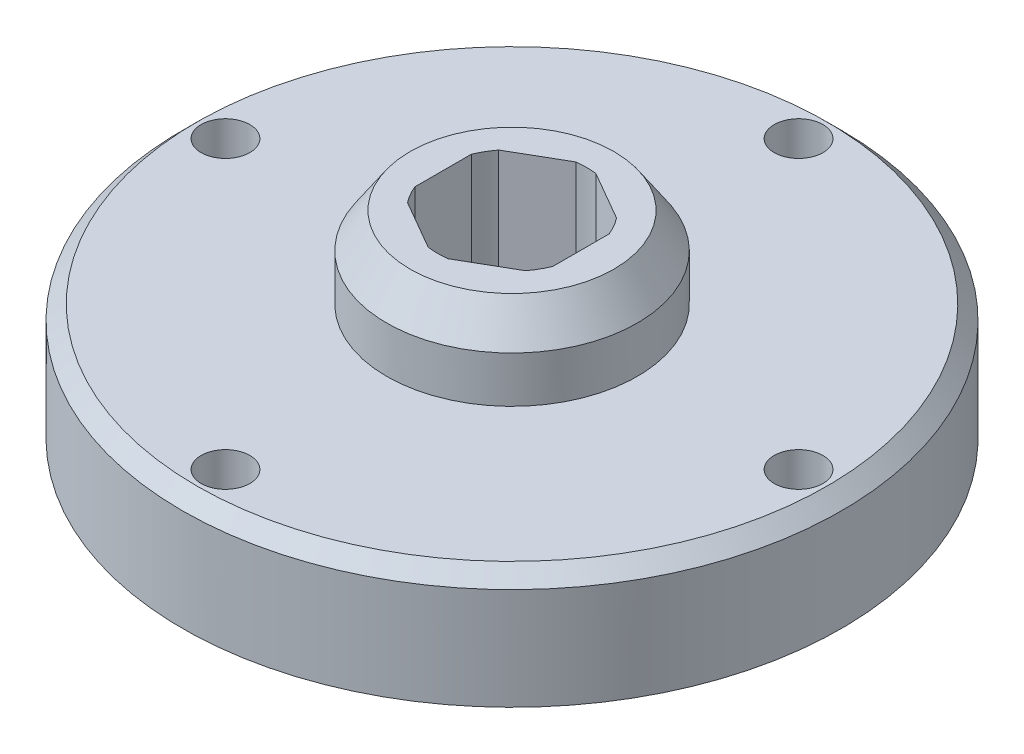
ISO-10303-21;
HEADER;
FILE_DESCRIPTION(('STEP AP214'),'2;1');
FILE_NAME('part.step','',(''),(''),'','','');
FILE_SCHEMA(('AUTOMOTIVE_DESIGN { 1 0 10303 214 1 1 1 1 }'));
ENDSEC;
DATA;
#1=APPLICATION_CONTEXT('core data for automotive mechanical design processes');
#2=APPLICATION_PROTOCOL_DEFINITION('international standard','automotive_design',2000,#1);
#3=PRODUCT_CONTEXT('',#1,'mechanical');
#4=PRODUCT('Part','Part','',(#3));
#5=PRODUCT_RELATED_PRODUCT_CATEGORY('part','',(#4));
#6=PRODUCT_DEFINITION_FORMATION('','',#4);
#7=PRODUCT_DEFINITION_CONTEXT('part definition',#1,'design');
#8=PRODUCT_DEFINITION('design','',#6,#7);
#9=PRODUCT_DEFINITION_SHAPE('','',#8);
#10=(LENGTH_UNIT() NAMED_UNIT(*) SI_UNIT(.MILLI.,.METRE.));
#11=(NAMED_UNIT(*) PLANE_ANGLE_UNIT() SI_UNIT($,.RADIAN.));
#12=(NAMED_UNIT(*) SI_UNIT($,.STERADIAN.) SOLID_ANGLE_UNIT());
#13=UNCERTAINTY_MEASURE_WITH_UNIT(LENGTH_MEASURE(1.E-05),#10,'distance_accuracy_value','');
#14=(GEOMETRIC_REPRESENTATION_CONTEXT(3) GLOBAL_UNCERTAINTY_ASSIGNED_CONTEXT((#13)) GLOBAL_UNIT_ASSIGNED_CONTEXT((#10,
#11,#12)) REPRESENTATION_CONTEXT('',''));
#15=CARTESIAN_POINT('',(0.,0.,0.));
#16=DIRECTION('',(0.,0.,1.));
#17=DIRECTION('',(1.,0.,0.));
#18=AXIS2_PLACEMENT_3D('',#15,#16,#17);
#19=CARTESIAN_POINT('',(0.,0.,0.));
#20=DIRECTION('',(0.,-1.,0.));
#21=DIRECTION('',(0.,0.,-1.));
#22=AXIS2_PLACEMENT_3D('',#19,#20,#21);
#23=CYLINDRICAL_SURFACE('',#22,5.2);
#24=CARTESIAN_POINT('',(0.,13.77578,0.));
#25=DIRECTION('',(0.,-1.,0.));
#26=DIRECTION('',(0.,0.,-1.));
#27=AXIS2_PLACEMENT_3D('',#24,#25,#26);
#28=CIRCLE('',#27,5.2);
#29=CARTESIAN_POINT('',(0.700412137687176,13.77578,5.15261320471278));
#30=VERTEX_POINT('',#29);
#31=CARTESIAN_POINT('',(-0.700412137687167,13.77578,5.15261320471278));
#32=VERTEX_POINT('',#31);
#33=EDGE_CURVE('E161',#30,#32,#28,.T.);
#34=ORIENTED_EDGE('',*,*,#33,.F.);
#35=DIRECTION('',(0.,-1.,0.));
#36=VECTOR('',#35,1.);
#37=CARTESIAN_POINT('',(0.700412137687176,17.7342558746265,5.15261320471278));
#38=LINE('',#37,#36);
#39=CARTESIAN_POINT('',(0.700412137687176,4.953,5.15261320471278));
#40=VERTEX_POINT('',#39);
#41=EDGE_CURVE('E147',#30,#40,#38,.T.);
#42=ORIENTED_EDGE('',*,*,#41,.T.);
#43=CARTESIAN_POINT('',(0.,4.953,0.));
#44=DIRECTION('',(0.,-1.,0.));
#45=DIRECTION('',(0.,0.,-1.));
#46=AXIS2_PLACEMENT_3D('',#43,#44,#45);
#47=CIRCLE('',#46,5.2);
#48=CARTESIAN_POINT('',(-0.700412137687167,4.953,5.15261320471278));
#49=VERTEX_POINT('',#48);
#50=EDGE_CURVE('E159',#40,#49,#47,.T.);
#51=ORIENTED_EDGE('',*,*,#50,.T.);
#52=DIRECTION('',(0.,-1.,0.));
#53=VECTOR('',#52,1.);
#54=CARTESIAN_POINT('',(-0.700412137687167,17.7342558746265,5.15261320471278));
#55=LINE('',#54,#53);
#56=EDGE_CURVE('E261',#32,#49,#55,.T.);
#57=ORIENTED_EDGE('',*,*,#56,.F.);
#58=EDGE_LOOP('',(#34,#42,#51,#57));
#59=FACE_BOUND('',#58,.T.);
#60=ADVANCED_FACE('F54',(#59),#23,.F.);
#61=CARTESIAN_POINT('',(4.8125,4.953,1.96973189800033));
#62=VERTEX_POINT('',#61);
#63=CARTESIAN_POINT('',(4.11208786231283,4.953,3.18288130671244));
#64=VERTEX_POINT('',#63);
#65=EDGE_CURVE('E169',#62,#64,#47,.T.);
#66=ORIENTED_EDGE('',*,*,#65,.T.);
#67=DIRECTION('',(0.,-1.,0.));
#68=VECTOR('',#67,1.);
#69=CARTESIAN_POINT('',(4.11208786231283,17.7342558746265,3.18288130671244));
#70=LINE('',#69,#68);
#71=CARTESIAN_POINT('',(4.11208786231283,13.77578,3.18288130671244));
#72=VERTEX_POINT('',#71);
#73=EDGE_CURVE('E150',#72,#64,#70,.T.);
#74=ORIENTED_EDGE('',*,*,#73,.F.);
#75=CARTESIAN_POINT('',(4.8125,13.77578,1.96973189800033));
#76=VERTEX_POINT('',#75);
#77=EDGE_CURVE('E317',#76,#72,#28,.T.);
#78=ORIENTED_EDGE('',*,*,#77,.F.);
#79=DIRECTION('',(0.,-1.,0.));
#80=VECTOR('',#79,1.);
#81=CARTESIAN_POINT('',(4.8125,17.7342558746265,1.96973189800033));
#82=LINE('',#81,#80);
#83=EDGE_CURVE('E221',#76,#62,#82,.T.);
#84=ORIENTED_EDGE('',*,*,#83,.T.);
#85=EDGE_LOOP('',(#66,#74,#78,#84));
#86=FACE_BOUND('',#85,.T.);
#87=ADVANCED_FACE('F360',(#86),#23,.F.);
#88=CARTESIAN_POINT('',(4.11208786231283,4.953,-3.18288130671244));
#89=VERTEX_POINT('',#88);
#90=CARTESIAN_POINT('',(4.8125,4.953,-1.96973189800033));
#91=VERTEX_POINT('',#90);
#92=EDGE_CURVE('E175',#89,#91,#47,.T.);
#93=ORIENTED_EDGE('',*,*,#92,.T.);
#94=DIRECTION('',(0.,-1.,0.));
#95=VECTOR('',#94,1.);
#96=CARTESIAN_POINT('',(4.8125,17.7342558746265,-1.96973189800033));
#97=LINE('',#96,#95);
#98=CARTESIAN_POINT('',(4.8125,13.77578,-1.96973189800033));
#99=VERTEX_POINT('',#98);
#100=EDGE_CURVE('E211',#99,#91,#97,.T.);
#101=ORIENTED_EDGE('',*,*,#100,.F.);
#102=CARTESIAN_POINT('',(4.11208786231283,13.77578,-3.18288130671244));
#103=VERTEX_POINT('',#102);
#104=EDGE_CURVE('E672',#103,#99,#28,.T.);
#105=ORIENTED_EDGE('',*,*,#104,.F.);
#106=DIRECTION('',(0.,-1.,0.));
#107=VECTOR('',#106,1.);
#108=CARTESIAN_POINT('',(4.11208786231283,17.7342558746265,-3.18288130671244));
#109=LINE('',#108,#107);
#110=EDGE_CURVE('E213',#103,#89,#109,.T.);
#111=ORIENTED_EDGE('',*,*,#110,.T.);
#112=EDGE_LOOP('',(#93,#101,#105,#111));
#113=FACE_BOUND('',#112,.T.);
#114=ADVANCED_FACE('F209',(#113),#23,.F.);
#115=CARTESIAN_POINT('',(-0.700412137687172,4.953,-5.15261320471278));
#116=VERTEX_POINT('',#115);
#117=CARTESIAN_POINT('',(0.700412137687175,4.953,-5.15261320471278));
#118=VERTEX_POINT('',#117);
#119=EDGE_CURVE('E192',#116,#118,#47,.T.);
#120=ORIENTED_EDGE('',*,*,#119,.T.);
#121=DIRECTION('',(0.,-1.,0.));
#122=VECTOR('',#121,1.);
#123=CARTESIAN_POINT('',(0.700412137687175,17.7342558746265,-5.15261320471278));
#124=LINE('',#123,#122);
#125=CARTESIAN_POINT('',(0.700412137687175,13.77578,-5.15261320471278));
#126=VERTEX_POINT('',#125);
#127=EDGE_CURVE('E230',#126,#118,#124,.T.);
#128=ORIENTED_EDGE('',*,*,#127,.F.);
#129=CARTESIAN_POINT('',(-0.700412137687172,13.77578,-5.15261320471278));
#130=VERTEX_POINT('',#129);
#131=EDGE_CURVE('E674',#130,#126,#28,.T.);
#132=ORIENTED_EDGE('',*,*,#131,.F.);
#133=DIRECTION('',(0.,-1.,0.));
#134=VECTOR('',#133,1.);
#135=CARTESIAN_POINT('',(-0.700412137687172,17.7342558746265,-5.15261320471278));
#136=LINE('',#135,#134);
#137=EDGE_CURVE('E245',#130,#116,#136,.T.);
#138=ORIENTED_EDGE('',*,*,#137,.T.);
#139=EDGE_LOOP('',(#120,#128,#132,#138));
#140=FACE_BOUND('',#139,.T.);
#141=ADVANCED_FACE('F381',(#140),#23,.F.);
#142=CARTESIAN_POINT('',(-4.8125,4.953,-1.96973189800034));
#143=VERTEX_POINT('',#142);
#144=CARTESIAN_POINT('',(-4.11208786231283,4.953,-3.18288130671244));
#145=VERTEX_POINT('',#144);
#146=EDGE_CURVE('E183',#143,#145,#47,.T.);
#147=ORIENTED_EDGE('',*,*,#146,.T.);
#148=DIRECTION('',(0.,-1.,0.));
#149=VECTOR('',#148,1.);
#150=CARTESIAN_POINT('',(-4.11208786231283,17.7342558746265,-3.18288130671244));
#151=LINE('',#150,#149);
#152=CARTESIAN_POINT('',(-4.11208786231283,13.77578,-3.18288130671244));
#153=VERTEX_POINT('',#152);
#154=EDGE_CURVE('E237',#153,#145,#151,.T.);
#155=ORIENTED_EDGE('',*,*,#154,.F.);
#156=CARTESIAN_POINT('',(-4.8125,13.77578,-1.96973189800034));
#157=VERTEX_POINT('',#156);
#158=EDGE_CURVE('E177',#157,#153,#28,.T.);
#159=ORIENTED_EDGE('',*,*,#158,.F.);
#160=DIRECTION('',(0.,-1.,0.));
#161=VECTOR('',#160,1.);
#162=CARTESIAN_POINT('',(-4.8125,17.7342558746265,-1.96973189800034));
#163=LINE('',#162,#161);
#164=EDGE_CURVE('E257',#157,#143,#163,.T.);
#165=ORIENTED_EDGE('',*,*,#164,.T.);
#166=EDGE_LOOP('',(#147,#155,#159,#165));
#167=FACE_BOUND('',#166,.T.);
#168=ADVANCED_FACE('F372',(#167),#23,.F.);
#169=CARTESIAN_POINT('',(-4.11208786231283,4.953,3.18288130671244));
#170=VERTEX_POINT('',#169);
#171=CARTESIAN_POINT('',(-4.8125,4.953,1.96973189800034));
#172=VERTEX_POINT('',#171);
#173=EDGE_CURVE('E172',#170,#172,#47,.T.);
#174=ORIENTED_EDGE('',*,*,#173,.T.);
#175=DIRECTION('',(0.,-1.,0.));
#176=VECTOR('',#175,1.);
#177=CARTESIAN_POINT('',(-4.8125,17.7342558746265,1.96973189800034));
#178=LINE('',#177,#176);
#179=CARTESIAN_POINT('',(-4.8125,13.77578,1.96973189800034));
#180=VERTEX_POINT('',#179);
#181=EDGE_CURVE('E249',#180,#172,#178,.T.);
#182=ORIENTED_EDGE('',*,*,#181,.F.);
#183=CARTESIAN_POINT('',(-4.11208786231283,13.77578,3.18288130671244));
#184=VERTEX_POINT('',#183);
#185=EDGE_CURVE('E170',#184,#180,#28,.T.);
#186=ORIENTED_EDGE('',*,*,#185,.F.);
#187=DIRECTION('',(0.,-1.,0.));
#188=VECTOR('',#187,1.);
#189=CARTESIAN_POINT('',(-4.11208786231283,17.7342558746265,3.18288130671244));
#190=LINE('',#189,#188);
#191=EDGE_CURVE('E268',#184,#170,#190,.T.);
#192=ORIENTED_EDGE('',*,*,#191,.T.);
#193=EDGE_LOOP('',(#174,#182,#186,#192));
#194=FACE_BOUND('',#193,.T.);
#195=ADVANCED_FACE('F362',(#194),#23,.F.);
#196=CARTESIAN_POINT('',(23.,0.,0.));
#197=DIRECTION('',(0.,-1.,0.));
#198=DIRECTION('',(0.,0.,-1.));
#199=AXIS2_PLACEMENT_3D('',#196,#197,#198);
#200=PLANE('',#199);
#201=CARTESIAN_POINT('',(0.,0.,0.));
#202=DIRECTION('',(0.,-1.,0.));
#203=DIRECTION('',(0.,0.,-1.));
#204=AXIS2_PLACEMENT_3D('',#201,#202,#203);
#205=CIRCLE('',#204,7.55);
#206=CARTESIAN_POINT('',(0.,0.,-7.55));
#207=VERTEX_POINT('',#206);
#208=EDGE_CURVE('E327',#207,#207,#205,.F.);
#209=ORIENTED_EDGE('',*,*,#208,.T.);
#210=EDGE_LOOP('',(#209));
#211=FACE_BOUND('',#210,.T.);
#212=CARTESIAN_POINT('',(-2.09488880330588E-13,0.,20.));
#213=DIRECTION('',(0.,-1.,0.));
#214=DIRECTION('',(0.,0.,-1.));
#215=AXIS2_PLACEMENT_3D('',#212,#213,#214);
#216=CIRCLE('',#215,1.69999999999999);
#217=CARTESIAN_POINT('',(-2.09488880330588E-13,0.,18.3));
#218=VERTEX_POINT('',#217);
#219=EDGE_CURVE('E272',#218,#218,#216,.T.);
#220=ORIENTED_EDGE('',*,*,#219,.F.);
#221=EDGE_LOOP('',(#220));
#222=FACE_BOUND('',#221,.T.);
#223=CARTESIAN_POINT('',(20.,0.,0.));
#224=DIRECTION('',(0.,-1.,0.));
#225=DIRECTION('',(0.,0.,-1.));
#226=AXIS2_PLACEMENT_3D('',#223,#224,#225);
#227=CIRCLE('',#226,1.69999999999999);
#228=CARTESIAN_POINT('',(20.,0.,-1.69999999999999));
#229=VERTEX_POINT('',#228);
#230=EDGE_CURVE('E284',#229,#229,#227,.T.);
#231=ORIENTED_EDGE('',*,*,#230,.F.);
#232=EDGE_LOOP('',(#231));
#233=FACE_BOUND('',#232,.T.);
#234=CARTESIAN_POINT('',(0.,0.,-20.));
#235=DIRECTION('',(0.,-1.,0.));
#236=DIRECTION('',(0.,0.,-1.));
#237=AXIS2_PLACEMENT_3D('',#234,#235,#236);
#238=CIRCLE('',#237,1.69999999999999);
#239=CARTESIAN_POINT('',(0.,0.,-21.7));
#240=VERTEX_POINT('',#239);
#241=EDGE_CURVE('E292',#240,#240,#238,.T.);
#242=ORIENTED_EDGE('',*,*,#241,.F.);
#243=EDGE_LOOP('',(#242));
#244=FACE_BOUND('',#243,.T.);
#245=CARTESIAN_POINT('',(-20.,0.,0.));
#246=DIRECTION('',(0.,-1.,0.));
#247=DIRECTION('',(0.,0.,-1.));
#248=AXIS2_PLACEMENT_3D('',#245,#246,#247);
#249=CIRCLE('',#248,1.69999999999999);
#250=CARTESIAN_POINT('',(-20.,0.,-1.69999999999999));
#251=VERTEX_POINT('',#250);
#252=EDGE_CURVE('E297',#251,#251,#249,.T.);
#253=ORIENTED_EDGE('',*,*,#252,.F.);
#254=EDGE_LOOP('',(#253));
#255=FACE_BOUND('',#254,.T.);
#256=CARTESIAN_POINT('',(0.,0.,0.));
#257=DIRECTION('',(0.,-1.,0.));
#258=DIRECTION('',(0.,0.,-1.));
#259=AXIS2_PLACEMENT_3D('',#256,#257,#258);
#260=CIRCLE('',#259,23.);
#261=CARTESIAN_POINT('',(0.,0.,-23.));
#262=VERTEX_POINT('',#261);
#263=EDGE_CURVE('E305',#262,#262,#260,.T.);
#264=ORIENTED_EDGE('',*,*,#263,.T.);
#265=EDGE_LOOP('',(#264));
#266=FACE_BOUND('',#265,.T.);
#267=ADVANCED_FACE('F371',(#211,#222,#233,#244,#255,#266),#200,.T.);
#268=CARTESIAN_POINT('',(0.,0.,0.));
#269=DIRECTION('',(0.,-1.,0.));
#270=DIRECTION('',(0.,0.,-1.));
#271=AXIS2_PLACEMENT_3D('',#268,#269,#270);
#272=CYLINDRICAL_SURFACE('',#271,6.8);
#273=CARTESIAN_POINT('',(0.,0.749999999999996,0.));
#274=DIRECTION('',(0.,-1.,0.));
#275=DIRECTION('',(0.,0.,-1.));
#276=AXIS2_PLACEMENT_3D('',#273,#274,#275);
#277=CIRCLE('',#276,6.8);
#278=CARTESIAN_POINT('',(0.,0.749999999999996,-6.8));
#279=VERTEX_POINT('',#278);
#280=EDGE_CURVE('E190',#279,#279,#277,.T.);
#281=ORIENTED_EDGE('',*,*,#280,.T.);
#282=EDGE_LOOP('',(#281));
#283=FACE_BOUND('',#282,.T.);
#284=CARTESIAN_POINT('',(0.,4.953,0.));
#285=DIRECTION('',(0.,-1.,0.));
#286=DIRECTION('',(0.,0.,-1.));
#287=AXIS2_PLACEMENT_3D('',#284,#285,#286);
#288=CIRCLE('',#287,6.8);
#289=CARTESIAN_POINT('',(0.,4.953,-6.8));
#290=VERTEX_POINT('',#289);
#291=EDGE_CURVE('E182',#290,#290,#288,.T.);
#292=ORIENTED_EDGE('',*,*,#291,.F.);
#293=EDGE_LOOP('',(#292));
#294=FACE_BOUND('',#293,.T.);
#295=ADVANCED_FACE('F378',(#283,#294),#272,.F.);
#296=CARTESIAN_POINT('',(6.8,4.953,0.));
#297=DIRECTION('',(0.,-1.,0.));
#298=DIRECTION('',(0.,0.,-1.));
#299=AXIS2_PLACEMENT_3D('',#296,#297,#298);
#300=PLANE('',#299);
#301=ORIENTED_EDGE('',*,*,#291,.T.);
#302=EDGE_LOOP('',(#301));
#303=FACE_BOUND('',#302,.T.);
#304=ORIENTED_EDGE('',*,*,#173,.F.);
#305=DIRECTION('',(-0.866025403784438,0.,-0.5));
#306=VECTOR('',#305,1.);
#307=CARTESIAN_POINT('',(-2.40625,4.953,4.16774725571261));
#308=LINE('',#307,#306);
#309=EDGE_CURVE('E167',#49,#170,#308,.T.);
#310=ORIENTED_EDGE('',*,*,#309,.F.);
#311=ORIENTED_EDGE('',*,*,#50,.F.);
#312=DIRECTION('',(-0.866025403784438,0.,0.5));
#313=VECTOR('',#312,1.);
#314=CARTESIAN_POINT('',(2.40625,4.953,4.16774725571261));
#315=LINE('',#314,#313);
#316=EDGE_CURVE('E144',#64,#40,#315,.T.);
#317=ORIENTED_EDGE('',*,*,#316,.F.);
#318=ORIENTED_EDGE('',*,*,#65,.F.);
#319=DIRECTION('',(0.,0.,1.));
#320=VECTOR('',#319,1.);
#321=CARTESIAN_POINT('',(4.8125,4.953,0.));
#322=LINE('',#321,#320);
#323=EDGE_CURVE('E217',#91,#62,#322,.T.);
#324=ORIENTED_EDGE('',*,*,#323,.F.);
#325=ORIENTED_EDGE('',*,*,#92,.F.);
#326=DIRECTION('',(0.866025403784439,0.,0.5));
#327=VECTOR('',#326,1.);
#328=CARTESIAN_POINT('',(2.40625,4.953,-4.16774725571261));
#329=LINE('',#328,#327);
#330=EDGE_CURVE('E216',#118,#89,#329,.T.);
#331=ORIENTED_EDGE('',*,*,#330,.F.);
#332=ORIENTED_EDGE('',*,*,#119,.F.);
#333=DIRECTION('',(0.866025403784439,0.,-0.5));
#334=VECTOR('',#333,1.);
#335=CARTESIAN_POINT('',(-2.40625,4.953,-4.16774725571261));
#336=LINE('',#335,#334);
#337=EDGE_CURVE('E242',#145,#116,#336,.T.);
#338=ORIENTED_EDGE('',*,*,#337,.F.);
#339=ORIENTED_EDGE('',*,*,#146,.F.);
#340=DIRECTION('',(0.,0.,-1.));
#341=VECTOR('',#340,1.);
#342=CARTESIAN_POINT('',(-4.8125,4.953,0.));
#343=LINE('',#342,#341);
#344=EDGE_CURVE('E254',#172,#143,#343,.T.);
#345=ORIENTED_EDGE('',*,*,#344,.F.);
#346=EDGE_LOOP('',(#304,#310,#311,#317,#318,#324,#325,#331,#332,#338,#339,#345));
#347=FACE_BOUND('',#346,.T.);
#348=ADVANCED_FACE('F166',(#303,#347),#300,.T.);
#349=CARTESIAN_POINT('',(5.2,13.77578,0.));
#350=DIRECTION('',(0.,1.,0.));
#351=DIRECTION('',(0.,0.,1.));
#352=AXIS2_PLACEMENT_3D('',#349,#350,#351);
#353=PLANE('',#352);
#354=ORIENTED_EDGE('',*,*,#185,.T.);
#355=DIRECTION('',(0.,0.,-1.));
#356=VECTOR('',#355,1.);
#357=CARTESIAN_POINT('',(-4.8125,13.77578,0.));
#358=LINE('',#357,#356);
#359=EDGE_CURVE('E258',#180,#157,#358,.T.);
#360=ORIENTED_EDGE('',*,*,#359,.T.);
#361=ORIENTED_EDGE('',*,*,#158,.T.);
#362=DIRECTION('',(0.866025403784439,0.,-0.5));
#363=VECTOR('',#362,1.);
#364=CARTESIAN_POINT('',(-2.40625,13.77578,-4.16774725571261));
#365=LINE('',#364,#363);
#366=EDGE_CURVE('E246',#153,#130,#365,.T.);
#367=ORIENTED_EDGE('',*,*,#366,.T.);
#368=ORIENTED_EDGE('',*,*,#131,.T.);
#369=DIRECTION('',(0.866025403784439,0.,0.5));
#370=VECTOR('',#369,1.);
#371=CARTESIAN_POINT('',(2.40625,13.77578,-4.16774725571261));
#372=LINE('',#371,#370);
#373=EDGE_CURVE('E234',#126,#103,#372,.T.);
#374=ORIENTED_EDGE('',*,*,#373,.T.);
#375=ORIENTED_EDGE('',*,*,#104,.T.);
#376=DIRECTION('',(0.,0.,1.));
#377=VECTOR('',#376,1.);
#378=CARTESIAN_POINT('',(4.8125,13.77578,0.));
#379=LINE('',#378,#377);
#380=EDGE_CURVE('E78',#99,#76,#379,.T.);
#381=ORIENTED_EDGE('',*,*,#380,.T.);
#382=ORIENTED_EDGE('',*,*,#77,.T.);
#383=DIRECTION('',(-0.866025403784438,0.,0.5));
#384=VECTOR('',#383,1.);
#385=CARTESIAN_POINT('',(2.40625,13.77578,4.16774725571261));
#386=LINE('',#385,#384);
#387=EDGE_CURVE('E72',#72,#30,#386,.T.);
#388=ORIENTED_EDGE('',*,*,#387,.T.);
#389=ORIENTED_EDGE('',*,*,#33,.T.);
#390=DIRECTION('',(-0.866025403784438,0.,-0.5));
#391=VECTOR('',#390,1.);
#392=CARTESIAN_POINT('',(-2.40625,13.77578,4.16774725571261));
#393=LINE('',#392,#391);
#394=EDGE_CURVE('E269',#32,#184,#393,.T.);
#395=ORIENTED_EDGE('',*,*,#394,.T.);
#396=EDGE_LOOP('',(#354,#360,#361,#367,#368,#374,#375,#381,#382,#388,#389,#395));
#397=FACE_BOUND('',#396,.T.);
#398=CARTESIAN_POINT('',(0.,13.77578,0.));
#399=DIRECTION('',(0.,-1.,0.));
#400=DIRECTION('',(0.,0.,-1.));
#401=AXIS2_PLACEMENT_3D('',#398,#399,#400);
#402=CIRCLE('',#401,7.112);
#403=CARTESIAN_POINT('',(0.,13.77578,-7.112));
#404=VERTEX_POINT('',#403);
#405=EDGE_CURVE('E309',#404,#404,#402,.T.);
#406=ORIENTED_EDGE('',*,*,#405,.F.);
#407=EDGE_LOOP('',(#406));
#408=FACE_BOUND('',#407,.T.);
#409=ADVANCED_FACE('F357',(#397,#408),#353,.T.);
#410=CARTESIAN_POINT('',(0.,11.11328,0.));
#411=DIRECTION('',(0.,-1.,0.));
#412=DIRECTION('',(0.,0.,-1.));
#413=AXIS2_PLACEMENT_3D('',#410,#411,#412);
#414=CONICAL_SURFACE('',#413,8.9,0.591375272041213);
#415=ORIENTED_EDGE('',*,*,#405,.T.);
#416=EDGE_LOOP('',(#415));
#417=FACE_BOUND('',#416,.T.);
#418=CARTESIAN_POINT('',(0.,11.3366440939597,0.));
#419=DIRECTION('',(0.,-1.,0.));
#420=DIRECTION('',(0.,0.,-1.));
#421=AXIS2_PLACEMENT_3D('',#418,#419,#420);
#422=CIRCLE('',#421,8.75);
#423=CARTESIAN_POINT('',(0.,11.3366440939597,-8.75));
#424=VERTEX_POINT('',#423);
#425=EDGE_CURVE('E312',#424,#424,#422,.T.);
#426=ORIENTED_EDGE('',*,*,#425,.F.);
#427=EDGE_LOOP('',(#426));
#428=FACE_BOUND('',#427,.T.);
#429=ADVANCED_FACE('F352',(#417,#428),#414,.T.);
#430=CARTESIAN_POINT('',(0.,0.,0.));
#431=DIRECTION('',(0.,-1.,0.));
#432=DIRECTION('',(0.,0.,-1.));
#433=AXIS2_PLACEMENT_3D('',#430,#431,#432);
#434=CYLINDRICAL_SURFACE('',#433,8.75);
#435=ORIENTED_EDGE('',*,*,#425,.T.);
#436=EDGE_LOOP('',(#435));
#437=FACE_BOUND('',#436,.T.);
#438=CARTESIAN_POINT('',(0.,8.11328,0.));
#439=DIRECTION('',(0.,1.,0.));
#440=DIRECTION('',(0.,0.,1.));
#441=AXIS2_PLACEMENT_3D('',#438,#439,#440);
#442=CIRCLE('',#441,8.75);
#443=CARTESIAN_POINT('',(0.,8.11328,8.75));
#444=VERTEX_POINT('',#443);
#445=EDGE_CURVE('E58',#444,#444,#442,.F.);
#446=ORIENTED_EDGE('',*,*,#445,.F.);
#447=EDGE_LOOP('',(#446));
#448=FACE_BOUND('',#447,.T.);
#449=ADVANCED_FACE('F56',(#437,#448),#434,.T.);
#450=CARTESIAN_POINT('',(8.9,8.11328,0.));
#451=DIRECTION('',(0.,1.,0.));
#452=DIRECTION('',(0.,0.,1.));
#453=AXIS2_PLACEMENT_3D('',#450,#451,#452);
#454=PLANE('',#453);
#455=CARTESIAN_POINT('',(0.,8.11328,0.));
#456=DIRECTION('',(0.,1.,0.));
#457=DIRECTION('',(0.,0.,1.));
#458=AXIS2_PLACEMENT_3D('',#455,#456,#457);
#459=CIRCLE('',#458,22.);
#460=CARTESIAN_POINT('',(0.,8.11328,22.));
#461=VERTEX_POINT('',#460);
#462=EDGE_CURVE('E12',#461,#461,#459,.T.);
#463=ORIENTED_EDGE('',*,*,#462,.T.);
#464=EDGE_LOOP('',(#463));
#465=FACE_BOUND('',#464,.T.);
#466=CARTESIAN_POINT('',(-2.09488880330588E-13,8.11328,20.));
#467=DIRECTION('',(0.,1.,0.));
#468=DIRECTION('',(0.,0.,1.));
#469=AXIS2_PLACEMENT_3D('',#466,#467,#468);
#470=CIRCLE('',#469,1.69999999999999);
#471=CARTESIAN_POINT('',(-2.09488880330588E-13,8.11328,21.7));
#472=VERTEX_POINT('',#471);
#473=EDGE_CURVE('E280',#472,#472,#470,.T.);
#474=ORIENTED_EDGE('',*,*,#473,.F.);
#475=EDGE_LOOP('',(#474));
#476=FACE_BOUND('',#475,.T.);
#477=CARTESIAN_POINT('',(20.,8.11328,0.));
#478=DIRECTION('',(0.,1.,0.));
#479=DIRECTION('',(0.,0.,1.));
#480=AXIS2_PLACEMENT_3D('',#477,#478,#479);
#481=CIRCLE('',#480,1.69999999999999);
#482=CARTESIAN_POINT('',(20.,8.11328,1.69999999999999));
#483=VERTEX_POINT('',#482);
#484=EDGE_CURVE('E288',#483,#483,#481,.T.);
#485=ORIENTED_EDGE('',*,*,#484,.F.);
#486=EDGE_LOOP('',(#485));
#487=FACE_BOUND('',#486,.T.);
#488=CARTESIAN_POINT('',(0.,8.11328,-20.));
#489=DIRECTION('',(0.,1.,0.));
#490=DIRECTION('',(0.,0.,1.));
#491=AXIS2_PLACEMENT_3D('',#488,#489,#490);
#492=CIRCLE('',#491,1.69999999999999);
#493=CARTESIAN_POINT('',(0.,8.11328,-18.3));
#494=VERTEX_POINT('',#493);
#495=EDGE_CURVE('E296',#494,#494,#492,.T.);
#496=ORIENTED_EDGE('',*,*,#495,.F.);
#497=EDGE_LOOP('',(#496));
#498=FACE_BOUND('',#497,.T.);
#499=CARTESIAN_POINT('',(-20.,8.11328,0.));
#500=DIRECTION('',(0.,1.,0.));
#501=DIRECTION('',(0.,0.,1.));
#502=AXIS2_PLACEMENT_3D('',#499,#500,#501);
#503=CIRCLE('',#502,1.69999999999999);
#504=CARTESIAN_POINT('',(-20.,8.11328,1.69999999999999));
#505=VERTEX_POINT('',#504);
#506=EDGE_CURVE('E301',#505,#505,#503,.T.);
#507=ORIENTED_EDGE('',*,*,#506,.F.);
#508=EDGE_LOOP('',(#507));
#509=FACE_BOUND('',#508,.T.);
#510=ORIENTED_EDGE('',*,*,#445,.T.);
#511=EDGE_LOOP('',(#510));
#512=FACE_BOUND('',#511,.T.);
#513=ADVANCED_FACE('F341',(#465,#476,#487,#498,#509,#512),#454,.T.);
#514=CARTESIAN_POINT('',(0.,0.,0.));
#515=DIRECTION('',(0.,-1.,0.));
#516=DIRECTION('',(0.,0.,-1.));
#517=AXIS2_PLACEMENT_3D('',#514,#515,#516);
#518=CYLINDRICAL_SURFACE('',#517,23.);
#519=CARTESIAN_POINT('',(0.,7.11327999999999,0.));
#520=DIRECTION('',(0.,1.,0.));
#521=DIRECTION('',(0.,0.,1.));
#522=AXIS2_PLACEMENT_3D('',#519,#520,#521);
#523=CIRCLE('',#522,23.);
#524=CARTESIAN_POINT('',(0.,7.11327999999999,23.));
#525=VERTEX_POINT('',#524);
#526=EDGE_CURVE('E64',#525,#525,#523,.F.);
#527=ORIENTED_EDGE('',*,*,#526,.T.);
#528=EDGE_LOOP('',(#527));
#529=FACE_BOUND('',#528,.T.);
#530=ORIENTED_EDGE('',*,*,#263,.F.);
#531=EDGE_LOOP('',(#530));
#532=FACE_BOUND('',#531,.T.);
#533=ADVANCED_FACE('F344',(#529,#532),#518,.T.);
#534=CARTESIAN_POINT('',(-20.,0.,0.));
#535=DIRECTION('',(0.,-1.,0.));
#536=DIRECTION('',(0.,0.,-1.));
#537=AXIS2_PLACEMENT_3D('',#534,#535,#536);
#538=CYLINDRICAL_SURFACE('',#537,1.69999999999999);
#539=ORIENTED_EDGE('',*,*,#506,.T.);
#540=EDGE_LOOP('',(#539));
#541=FACE_BOUND('',#540,.T.);
#542=ORIENTED_EDGE('',*,*,#252,.T.);
#543=EDGE_LOOP('',(#542));
#544=FACE_BOUND('',#543,.T.);
#545=ADVANCED_FACE('F564',(#541,#544),#538,.F.);
#546=CARTESIAN_POINT('',(0.,0.,-20.));
#547=DIRECTION('',(0.,-1.,0.));
#548=DIRECTION('',(0.,0.,-1.));
#549=AXIS2_PLACEMENT_3D('',#546,#547,#548);
#550=CYLINDRICAL_SURFACE('',#549,1.69999999999999);
#551=ORIENTED_EDGE('',*,*,#495,.T.);
#552=EDGE_LOOP('',(#551));
#553=FACE_BOUND('',#552,.T.);
#554=ORIENTED_EDGE('',*,*,#241,.T.);
#555=EDGE_LOOP('',(#554));
#556=FACE_BOUND('',#555,.T.);
#557=ADVANCED_FACE('F338',(#553,#556),#550,.F.);
#558=CARTESIAN_POINT('',(20.,0.,0.));
#559=DIRECTION('',(0.,-1.,0.));
#560=DIRECTION('',(0.,0.,-1.));
#561=AXIS2_PLACEMENT_3D('',#558,#559,#560);
#562=CYLINDRICAL_SURFACE('',#561,1.69999999999999);
#563=ORIENTED_EDGE('',*,*,#484,.T.);
#564=EDGE_LOOP('',(#563));
#565=FACE_BOUND('',#564,.T.);
#566=ORIENTED_EDGE('',*,*,#230,.T.);
#567=EDGE_LOOP('',(#566));
#568=FACE_BOUND('',#567,.T.);
#569=ADVANCED_FACE('F577',(#565,#568),#562,.F.);
#570=CARTESIAN_POINT('',(-2.09488880330588E-13,0.,20.));
#571=DIRECTION('',(0.,-1.,0.));
#572=DIRECTION('',(0.,0.,-1.));
#573=AXIS2_PLACEMENT_3D('',#570,#571,#572);
#574=CYLINDRICAL_SURFACE('',#573,1.69999999999999);
#575=ORIENTED_EDGE('',*,*,#473,.T.);
#576=EDGE_LOOP('',(#575));
#577=FACE_BOUND('',#576,.T.);
#578=ORIENTED_EDGE('',*,*,#219,.T.);
#579=EDGE_LOOP('',(#578));
#580=FACE_BOUND('',#579,.T.);
#581=ADVANCED_FACE('F463',(#577,#580),#574,.F.);
#582=CARTESIAN_POINT('',(-2.40625,17.7342558746265,4.16774725571261));
#583=DIRECTION('',(-0.5,0.,0.866025403784438));
#584=DIRECTION('',(0.866025403784438,0.,0.5));
#585=AXIS2_PLACEMENT_3D('',#582,#583,#584);
#586=PLANE('',#585);
#587=ORIENTED_EDGE('',*,*,#394,.F.);
#588=ORIENTED_EDGE('',*,*,#56,.T.);
#589=ORIENTED_EDGE('',*,*,#309,.T.);
#590=ORIENTED_EDGE('',*,*,#191,.F.);
#591=EDGE_LOOP('',(#587,#588,#589,#590));
#592=FACE_BOUND('',#591,.T.);
#593=ADVANCED_FACE('F458',(#592),#586,.F.);
#594=CARTESIAN_POINT('',(-4.8125,17.7342558746265,0.));
#595=DIRECTION('',(-1.,0.,0.));
#596=DIRECTION('',(0.,0.,1.));
#597=AXIS2_PLACEMENT_3D('',#594,#595,#596);
#598=PLANE('',#597);
#599=ORIENTED_EDGE('',*,*,#359,.F.);
#600=ORIENTED_EDGE('',*,*,#181,.T.);
#601=ORIENTED_EDGE('',*,*,#344,.T.);
#602=ORIENTED_EDGE('',*,*,#164,.F.);
#603=EDGE_LOOP('',(#599,#600,#601,#602));
#604=FACE_BOUND('',#603,.T.);
#605=ADVANCED_FACE('F462',(#604),#598,.F.);
#606=CARTESIAN_POINT('',(-2.40625,17.7342558746265,-4.16774725571261));
#607=DIRECTION('',(-0.5,0.,-0.866025403784439));
#608=DIRECTION('',(-0.866025403784439,0.,0.5));
#609=AXIS2_PLACEMENT_3D('',#606,#607,#608);
#610=PLANE('',#609);
#611=ORIENTED_EDGE('',*,*,#366,.F.);
#612=ORIENTED_EDGE('',*,*,#154,.T.);
#613=ORIENTED_EDGE('',*,*,#337,.T.);
#614=ORIENTED_EDGE('',*,*,#137,.F.);
#615=EDGE_LOOP('',(#611,#612,#613,#614));
#616=FACE_BOUND('',#615,.T.);
#617=ADVANCED_FACE('F473',(#616),#610,.F.);
#618=CARTESIAN_POINT('',(2.40625,17.7342558746265,-4.16774725571261));
#619=DIRECTION('',(0.5,0.,-0.866025403784439));
#620=DIRECTION('',(-0.866025403784439,0.,-0.5));
#621=AXIS2_PLACEMENT_3D('',#618,#619,#620);
#622=PLANE('',#621);
#623=ORIENTED_EDGE('',*,*,#373,.F.);
#624=ORIENTED_EDGE('',*,*,#127,.T.);
#625=ORIENTED_EDGE('',*,*,#330,.T.);
#626=ORIENTED_EDGE('',*,*,#110,.F.);
#627=EDGE_LOOP('',(#623,#624,#625,#626));
#628=FACE_BOUND('',#627,.T.);
#629=ADVANCED_FACE('F483',(#628),#622,.F.);
#630=CARTESIAN_POINT('',(4.8125,17.7342558746265,0.));
#631=DIRECTION('',(1.,0.,0.));
#632=DIRECTION('',(0.,0.,-1.));
#633=AXIS2_PLACEMENT_3D('',#630,#631,#632);
#634=PLANE('',#633);
#635=ORIENTED_EDGE('',*,*,#380,.F.);
#636=ORIENTED_EDGE('',*,*,#100,.T.);
#637=ORIENTED_EDGE('',*,*,#323,.T.);
#638=ORIENTED_EDGE('',*,*,#83,.F.);
#639=EDGE_LOOP('',(#635,#636,#637,#638));
#640=FACE_BOUND('',#639,.T.);
#641=ADVANCED_FACE('F493',(#640),#634,.F.);
#642=CARTESIAN_POINT('',(2.40625,17.7342558746265,4.16774725571261));
#643=DIRECTION('',(0.5,0.,0.866025403784438));
#644=DIRECTION('',(0.866025403784438,0.,-0.5));
#645=AXIS2_PLACEMENT_3D('',#642,#643,#644);
#646=PLANE('',#645);
#647=ORIENTED_EDGE('',*,*,#387,.F.);
#648=ORIENTED_EDGE('',*,*,#73,.T.);
#649=ORIENTED_EDGE('',*,*,#316,.T.);
#650=ORIENTED_EDGE('',*,*,#41,.F.);
#651=EDGE_LOOP('',(#647,#648,#649,#650));
#652=FACE_BOUND('',#651,.T.);
#653=ADVANCED_FACE('F146',(#652),#646,.F.);
#654=CARTESIAN_POINT('',(0.,0.749999999999996,0.));
#655=DIRECTION('',(0.,-1.,0.));
#656=DIRECTION('',(0.,0.,-1.));
#657=AXIS2_PLACEMENT_3D('',#654,#655,#656);
#658=CONICAL_SURFACE('',#657,6.8,0.785398163397451);
#659=ORIENTED_EDGE('',*,*,#208,.F.);
#660=EDGE_LOOP('',(#659));
#661=FACE_BOUND('',#660,.T.);
#662=ORIENTED_EDGE('',*,*,#280,.F.);
#663=EDGE_LOOP('',(#662));
#664=FACE_BOUND('',#663,.T.);
#665=ADVANCED_FACE('F511',(#661,#664),#658,.F.);
#666=CARTESIAN_POINT('',(0.,7.11327999999999,0.));
#667=DIRECTION('',(0.,-1.,0.));
#668=DIRECTION('',(0.,0.,-1.));
#669=AXIS2_PLACEMENT_3D('',#666,#667,#668);
#670=CONICAL_SURFACE('',#669,23.,0.785398163397448);
#671=ORIENTED_EDGE('',*,*,#462,.F.);
#672=EDGE_LOOP('',(#671));
#673=FACE_BOUND('',#672,.T.);
#674=ORIENTED_EDGE('',*,*,#526,.F.);
#675=EDGE_LOOP('',(#674));
#676=FACE_BOUND('',#675,.T.);
#677=ADVANCED_FACE('F522',(#673,#676),#670,.T.);
#678=CLOSED_SHELL('',(#60,#87,#114,#141,#168,#195,#267,#295,#348,#409,#429,#449,#513,#533,#545,
#557,#569,#581,#593,#605,#617,#629,#641,#653,#665,#677));
#679=MANIFOLD_SOLID_BREP('B2',#678);
#680=ADVANCED_BREP_SHAPE_REPRESENTATION('',(#18,#679),#14);
#681=SHAPE_DEFINITION_REPRESENTATION(#9,#680);
ENDSEC;
END-ISO-10303-21;
